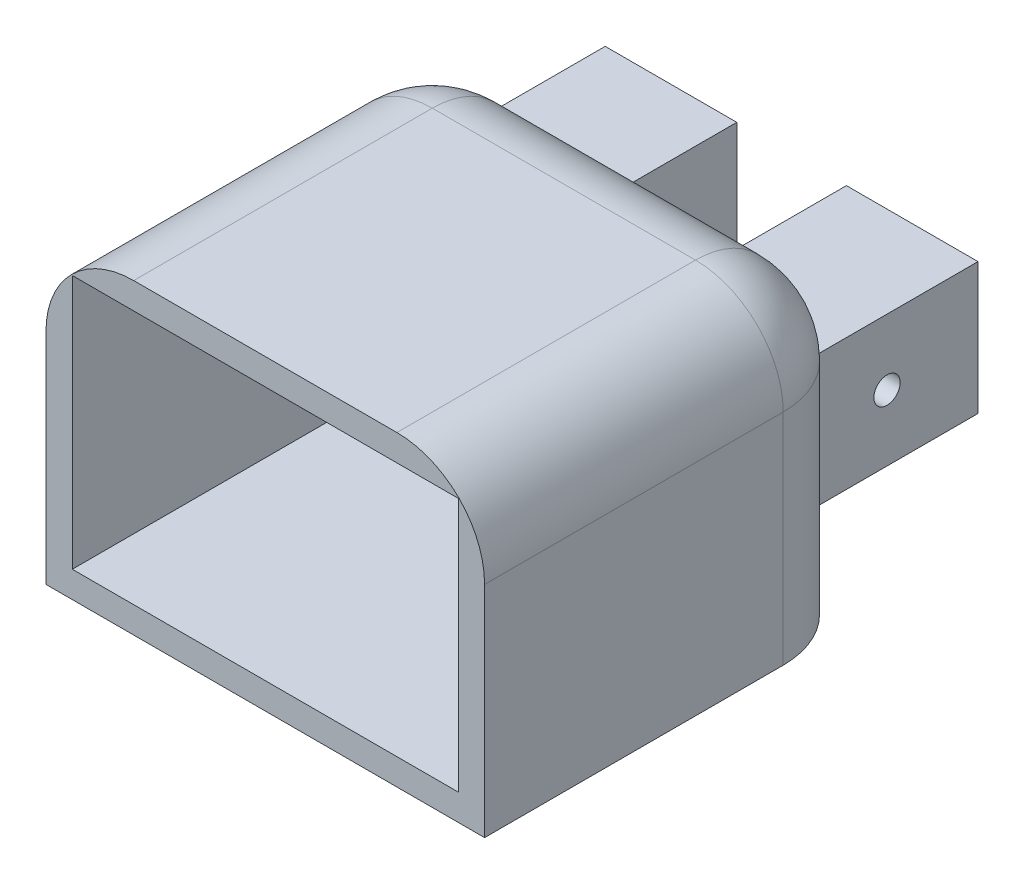
ISO-10303-21;
HEADER;
FILE_DESCRIPTION(('STEP AP214'),'2;1');
FILE_NAME('part.step','',(''),(''),'','','');
FILE_SCHEMA(('AUTOMOTIVE_DESIGN { 1 0 10303 214 1 1 1 1 }'));
ENDSEC;
DATA;
#1=APPLICATION_CONTEXT('core data for automotive mechanical design processes');
#2=APPLICATION_PROTOCOL_DEFINITION('international standard','automotive_design',2000,#1);
#3=PRODUCT_CONTEXT('',#1,'mechanical');
#4=PRODUCT('Part','Part','',(#3));
#5=PRODUCT_RELATED_PRODUCT_CATEGORY('part','',(#4));
#6=PRODUCT_DEFINITION_FORMATION('','',#4);
#7=PRODUCT_DEFINITION_CONTEXT('part definition',#1,'design');
#8=PRODUCT_DEFINITION('design','',#6,#7);
#9=PRODUCT_DEFINITION_SHAPE('','',#8);
#10=(LENGTH_UNIT() NAMED_UNIT(*) SI_UNIT(.MILLI.,.METRE.));
#11=(NAMED_UNIT(*) PLANE_ANGLE_UNIT() SI_UNIT($,.RADIAN.));
#12=(NAMED_UNIT(*) SI_UNIT($,.STERADIAN.) SOLID_ANGLE_UNIT());
#13=UNCERTAINTY_MEASURE_WITH_UNIT(LENGTH_MEASURE(1.E-05),#10,'distance_accuracy_value','');
#14=(GEOMETRIC_REPRESENTATION_CONTEXT(3) GLOBAL_UNCERTAINTY_ASSIGNED_CONTEXT((#13)) GLOBAL_UNIT_ASSIGNED_CONTEXT((#10,
#11,#12)) REPRESENTATION_CONTEXT('',''));
#15=CARTESIAN_POINT('',(0.,0.,0.));
#16=DIRECTION('',(0.,0.,1.));
#17=DIRECTION('',(1.,0.,0.));
#18=AXIS2_PLACEMENT_3D('',#15,#16,#17);
#19=CARTESIAN_POINT('',(-25.,35.,-40.2308510649238));
#20=DIRECTION('',(0.,0.,1.));
#21=DIRECTION('',(1.,0.,0.));
#22=AXIS2_PLACEMENT_3D('',#19,#20,#21);
#23=PLANE('',#22);
#24=DIRECTION('',(0.,-1.,0.));
#25=VECTOR('',#24,1.);
#26=CARTESIAN_POINT('',(-6.25000000000001,36.,-40.2308510649238));
#27=LINE('',#26,#25);
#28=CARTESIAN_POINT('',(-6.25000000000001,25.,-40.2308510649238));
#29=VERTEX_POINT('',#28);
#30=CARTESIAN_POINT('',(-6.25000000000001,10.,-40.2308510649238));
#31=VERTEX_POINT('',#30);
#32=EDGE_CURVE('E196',#29,#31,#27,.T.);
#33=ORIENTED_EDGE('',*,*,#32,.T.);
#34=DIRECTION('',(-1.,0.,0.));
#35=VECTOR('',#34,1.);
#36=CARTESIAN_POINT('',(28.92,10.,-40.2308510649238));
#37=LINE('',#36,#35);
#38=CARTESIAN_POINT('',(-21.25,10.,-40.2308510649238));
#39=VERTEX_POINT('',#38);
#40=EDGE_CURVE('E194',#31,#39,#37,.T.);
#41=ORIENTED_EDGE('',*,*,#40,.T.);
#42=DIRECTION('',(0.,-1.,0.));
#43=VECTOR('',#42,1.);
#44=CARTESIAN_POINT('',(-21.25,36.,-40.2308510649238));
#45=LINE('',#44,#43);
#46=CARTESIAN_POINT('',(-21.25,25.,-40.2308510649238));
#47=VERTEX_POINT('',#46);
#48=EDGE_CURVE('E188',#47,#39,#45,.T.);
#49=ORIENTED_EDGE('',*,*,#48,.F.);
#50=DIRECTION('',(-1.,0.,0.));
#51=VECTOR('',#50,1.);
#52=CARTESIAN_POINT('',(28.92,25.,-40.2308510649238));
#53=LINE('',#52,#51);
#54=EDGE_CURVE('E175',#29,#47,#53,.T.);
#55=ORIENTED_EDGE('',*,*,#54,.F.);
#56=EDGE_LOOP('',(#33,#41,#49,#55));
#57=FACE_BOUND('',#56,.T.);
#58=ADVANCED_FACE('F35',(#57),#23,.F.);
#59=CARTESIAN_POINT('',(-25.,35.,19.7691489350762));
#60=DIRECTION('',(0.,0.,-1.));
#61=DIRECTION('',(-1.,0.,0.));
#62=AXIS2_PLACEMENT_3D('',#59,#60,#61);
#63=PLANE('',#62);
#64=DIRECTION('',(1.,0.,0.));
#65=VECTOR('',#64,1.);
#66=CARTESIAN_POINT('',(-22.,3.,19.7691489350762));
#67=LINE('',#66,#65);
#68=CARTESIAN_POINT('',(-22.,3.,19.7691489350762));
#69=VERTEX_POINT('',#68);
#70=CARTESIAN_POINT('',(22.,3.,19.7691489350762));
#71=VERTEX_POINT('',#70);
#72=EDGE_CURVE('E198',#69,#71,#67,.T.);
#73=ORIENTED_EDGE('',*,*,#72,.F.);
#74=DIRECTION('',(0.,-1.,0.));
#75=VECTOR('',#74,1.);
#76=CARTESIAN_POINT('',(-22.,32.,19.7691489350762));
#77=LINE('',#76,#75);
#78=CARTESIAN_POINT('',(-22.,32.,19.7691489350762));
#79=VERTEX_POINT('',#78);
#80=EDGE_CURVE('E195',#79,#69,#77,.T.);
#81=ORIENTED_EDGE('',*,*,#80,.F.);
#82=DIRECTION('',(-1.,0.,0.));
#83=VECTOR('',#82,1.);
#84=CARTESIAN_POINT('',(-22.,32.,19.7691489350762));
#85=LINE('',#84,#83);
#86=CARTESIAN_POINT('',(22.,32.,19.7691489350762));
#87=VERTEX_POINT('',#86);
#88=EDGE_CURVE('E221',#87,#79,#85,.T.);
#89=ORIENTED_EDGE('',*,*,#88,.F.);
#90=DIRECTION('',(0.,1.,0.));
#91=VECTOR('',#90,1.);
#92=CARTESIAN_POINT('',(22.,32.,19.7691489350762));
#93=LINE('',#92,#91);
#94=EDGE_CURVE('E233',#71,#87,#93,.T.);
#95=ORIENTED_EDGE('',*,*,#94,.F.);
#96=EDGE_LOOP('',(#73,#81,#89,#95));
#97=FACE_BOUND('',#96,.T.);
#98=DIRECTION('',(0.,-1.,0.));
#99=VECTOR('',#98,1.);
#100=CARTESIAN_POINT('',(25.,35.,19.7691489350762));
#101=LINE('',#100,#99);
#102=CARTESIAN_POINT('',(25.,25.,19.7691489350762));
#103=VERTEX_POINT('',#102);
#104=CARTESIAN_POINT('',(25.,0.,19.7691489350762));
#105=VERTEX_POINT('',#104);
#106=EDGE_CURVE('E260',#103,#105,#101,.T.);
#107=ORIENTED_EDGE('',*,*,#106,.F.);
#108=CARTESIAN_POINT('',(15.,25.,19.7691489350762));
#109=DIRECTION('',(0.,0.,-1.));
#110=DIRECTION('',(-1.,0.,0.));
#111=AXIS2_PLACEMENT_3D('',#108,#109,#110);
#112=CIRCLE('',#111,10.);
#113=CARTESIAN_POINT('',(15.,35.,19.7691489350762));
#114=VERTEX_POINT('',#113);
#115=EDGE_CURVE('E310',#103,#114,#112,.F.);
#116=ORIENTED_EDGE('',*,*,#115,.T.);
#117=DIRECTION('',(1.,0.,0.));
#118=VECTOR('',#117,1.);
#119=CARTESIAN_POINT('',(-25.,35.,19.7691489350762));
#120=LINE('',#119,#118);
#121=CARTESIAN_POINT('',(-15.,35.,19.7691489350762));
#122=VERTEX_POINT('',#121);
#123=EDGE_CURVE('E247',#122,#114,#120,.T.);
#124=ORIENTED_EDGE('',*,*,#123,.F.);
#125=CARTESIAN_POINT('',(-15.,25.,19.7691489350762));
#126=DIRECTION('',(0.,0.,-1.));
#127=DIRECTION('',(-1.,0.,0.));
#128=AXIS2_PLACEMENT_3D('',#125,#126,#127);
#129=CIRCLE('',#128,10.);
#130=CARTESIAN_POINT('',(-25.,25.,19.7691489350762));
#131=VERTEX_POINT('',#130);
#132=EDGE_CURVE('E308',#122,#131,#129,.F.);
#133=ORIENTED_EDGE('',*,*,#132,.T.);
#134=DIRECTION('',(0.,-1.,0.));
#135=VECTOR('',#134,1.);
#136=CARTESIAN_POINT('',(-25.,35.,19.7691489350762));
#137=LINE('',#136,#135);
#138=CARTESIAN_POINT('',(-25.,0.,19.7691489350762));
#139=VERTEX_POINT('',#138);
#140=EDGE_CURVE('E250',#131,#139,#137,.T.);
#141=ORIENTED_EDGE('',*,*,#140,.T.);
#142=DIRECTION('',(1.,0.,0.));
#143=VECTOR('',#142,1.);
#144=CARTESIAN_POINT('',(-25.,0.,19.7691489350762));
#145=LINE('',#144,#143);
#146=EDGE_CURVE('E240',#139,#105,#145,.T.);
#147=ORIENTED_EDGE('',*,*,#146,.T.);
#148=EDGE_LOOP('',(#107,#116,#124,#133,#141,#147));
#149=FACE_BOUND('',#148,.T.);
#150=ADVANCED_FACE('F347',(#97,#149),#63,.F.);
#151=CARTESIAN_POINT('',(25.,35.,-40.2308510649238));
#152=DIRECTION('',(-1.,0.,0.));
#153=DIRECTION('',(0.,0.,1.));
#154=AXIS2_PLACEMENT_3D('',#151,#152,#153);
#155=PLANE('',#154);
#156=DIRECTION('',(0.,0.,-1.));
#157=VECTOR('',#156,1.);
#158=CARTESIAN_POINT('',(25.,0.,-40.2308510649238));
#159=LINE('',#158,#157);
#160=CARTESIAN_POINT('',(25.,0.,-14.2749331346808));
#161=VERTEX_POINT('',#160);
#162=EDGE_CURVE('E254',#105,#161,#159,.T.);
#163=ORIENTED_EDGE('',*,*,#162,.T.);
#164=DIRECTION('',(0.,1.,0.));
#165=VECTOR('',#164,1.);
#166=CARTESIAN_POINT('',(25.,35.,-14.2749331346808));
#167=LINE('',#166,#165);
#168=CARTESIAN_POINT('',(25.,25.,-14.2749331346808));
#169=VERTEX_POINT('',#168);
#170=EDGE_CURVE('E284',#161,#169,#167,.T.);
#171=ORIENTED_EDGE('',*,*,#170,.T.);
#172=DIRECTION('',(0.,0.,-1.));
#173=VECTOR('',#172,1.);
#174=CARTESIAN_POINT('',(25.,25.,-40.2308510649238));
#175=LINE('',#174,#173);
#176=EDGE_CURVE('E282',#169,#103,#175,.F.);
#177=ORIENTED_EDGE('',*,*,#176,.T.);
#178=ORIENTED_EDGE('',*,*,#106,.T.);
#179=EDGE_LOOP('',(#163,#171,#177,#178));
#180=FACE_BOUND('',#179,.T.);
#181=ADVANCED_FACE('F407',(#180),#155,.F.);
#182=DIRECTION('',(0.,-1.,0.));
#183=VECTOR('',#182,1.);
#184=CARTESIAN_POINT('',(21.25,36.,-40.2308510649238));
#185=LINE('',#184,#183);
#186=CARTESIAN_POINT('',(21.25,25.,-40.2308510649238));
#187=VERTEX_POINT('',#186);
#188=CARTESIAN_POINT('',(21.25,10.,-40.2308510649238));
#189=VERTEX_POINT('',#188);
#190=EDGE_CURVE('E214',#187,#189,#185,.T.);
#191=ORIENTED_EDGE('',*,*,#190,.T.);
#192=CARTESIAN_POINT('',(6.25,10.,-40.2308510649238));
#193=VERTEX_POINT('',#192);
#194=EDGE_CURVE('E369',#189,#193,#37,.T.);
#195=ORIENTED_EDGE('',*,*,#194,.T.);
#196=DIRECTION('',(0.,-1.,0.));
#197=VECTOR('',#196,1.);
#198=CARTESIAN_POINT('',(6.25,36.,-40.2308510649238));
#199=LINE('',#198,#197);
#200=CARTESIAN_POINT('',(6.25,25.,-40.2308510649238));
#201=VERTEX_POINT('',#200);
#202=EDGE_CURVE('E211',#201,#193,#199,.T.);
#203=ORIENTED_EDGE('',*,*,#202,.F.);
#204=EDGE_CURVE('E185',#187,#201,#53,.T.);
#205=ORIENTED_EDGE('',*,*,#204,.F.);
#206=EDGE_LOOP('',(#191,#195,#203,#205));
#207=FACE_BOUND('',#206,.T.);
#208=ADVANCED_FACE('F403',(#207),#23,.F.);
#209=CARTESIAN_POINT('',(-25.,35.,-40.2308510649238));
#210=DIRECTION('',(1.,0.,0.));
#211=DIRECTION('',(0.,0.,-1.));
#212=AXIS2_PLACEMENT_3D('',#209,#210,#211);
#213=PLANE('',#212);
#214=DIRECTION('',(0.,0.,1.));
#215=VECTOR('',#214,1.);
#216=CARTESIAN_POINT('',(-25.,25.,-40.2308510649238));
#217=LINE('',#216,#215);
#218=CARTESIAN_POINT('',(-25.,25.,-14.2749331346808));
#219=VERTEX_POINT('',#218);
#220=EDGE_CURVE('E299',#131,#219,#217,.F.);
#221=ORIENTED_EDGE('',*,*,#220,.T.);
#222=DIRECTION('',(0.,-1.,0.));
#223=VECTOR('',#222,1.);
#224=CARTESIAN_POINT('',(-25.,35.,-14.2749331346808));
#225=LINE('',#224,#223);
#226=CARTESIAN_POINT('',(-25.,0.,-14.2749331346808));
#227=VERTEX_POINT('',#226);
#228=EDGE_CURVE('E301',#219,#227,#225,.T.);
#229=ORIENTED_EDGE('',*,*,#228,.T.);
#230=DIRECTION('',(0.,0.,1.));
#231=VECTOR('',#230,1.);
#232=CARTESIAN_POINT('',(-25.,0.,-40.2308510649238));
#233=LINE('',#232,#231);
#234=EDGE_CURVE('E251',#227,#139,#233,.T.);
#235=ORIENTED_EDGE('',*,*,#234,.T.);
#236=ORIENTED_EDGE('',*,*,#140,.F.);
#237=EDGE_LOOP('',(#221,#229,#235,#236));
#238=FACE_BOUND('',#237,.T.);
#239=ADVANCED_FACE('F413',(#238),#213,.F.);
#240=CARTESIAN_POINT('',(0.,35.,0.));
#241=DIRECTION('',(0.,-1.,0.));
#242=DIRECTION('',(0.,0.,-1.));
#243=AXIS2_PLACEMENT_3D('',#240,#241,#242);
#244=PLANE('',#243);
#245=ORIENTED_EDGE('',*,*,#123,.T.);
#246=DIRECTION('',(0.,0.,-1.));
#247=VECTOR('',#246,1.);
#248=CARTESIAN_POINT('',(15.,35.,0.));
#249=LINE('',#248,#247);
#250=CARTESIAN_POINT('',(15.,35.,-14.2749331346808));
#251=VERTEX_POINT('',#250);
#252=EDGE_CURVE('E306',#114,#251,#249,.T.);
#253=ORIENTED_EDGE('',*,*,#252,.T.);
#254=DIRECTION('',(-1.,0.,0.));
#255=VECTOR('',#254,1.);
#256=CARTESIAN_POINT('',(0.,35.,-14.2749331346808));
#257=LINE('',#256,#255);
#258=CARTESIAN_POINT('',(-15.,35.,-14.2749331346808));
#259=VERTEX_POINT('',#258);
#260=EDGE_CURVE('E276',#251,#259,#257,.T.);
#261=ORIENTED_EDGE('',*,*,#260,.T.);
#262=DIRECTION('',(0.,0.,1.));
#263=VECTOR('',#262,1.);
#264=CARTESIAN_POINT('',(-15.,35.,0.));
#265=LINE('',#264,#263);
#266=EDGE_CURVE('E304',#259,#122,#265,.T.);
#267=ORIENTED_EDGE('',*,*,#266,.T.);
#268=EDGE_LOOP('',(#245,#253,#261,#267));
#269=FACE_BOUND('',#268,.T.);
#270=ADVANCED_FACE('F342',(#269),#244,.F.);
#271=CARTESIAN_POINT('',(0.,0.,0.));
#272=DIRECTION('',(0.,-1.,0.));
#273=DIRECTION('',(0.,0.,-1.));
#274=AXIS2_PLACEMENT_3D('',#271,#272,#273);
#275=PLANE('',#274);
#276=DIRECTION('',(-1.,0.,0.));
#277=VECTOR('',#276,1.);
#278=CARTESIAN_POINT('',(0.,0.,-24.2749331346808));
#279=LINE('',#278,#277);
#280=CARTESIAN_POINT('',(15.,0.,-24.2749331346808));
#281=VERTEX_POINT('',#280);
#282=CARTESIAN_POINT('',(-15.,0.,-24.2749331346808));
#283=VERTEX_POINT('',#282);
#284=EDGE_CURVE('E262',#281,#283,#279,.T.);
#285=ORIENTED_EDGE('',*,*,#284,.F.);
#286=CARTESIAN_POINT('',(15.,0.,-14.2749331346808));
#287=DIRECTION('',(0.,-1.,0.));
#288=DIRECTION('',(0.,0.,-1.));
#289=AXIS2_PLACEMENT_3D('',#286,#287,#288);
#290=CIRCLE('',#289,10.);
#291=EDGE_CURVE('E293',#281,#161,#290,.T.);
#292=ORIENTED_EDGE('',*,*,#291,.T.);
#293=ORIENTED_EDGE('',*,*,#162,.F.);
#294=ORIENTED_EDGE('',*,*,#146,.F.);
#295=ORIENTED_EDGE('',*,*,#234,.F.);
#296=CARTESIAN_POINT('',(-15.,0.,-14.2749331346808));
#297=DIRECTION('',(0.,-1.,0.));
#298=DIRECTION('',(0.,0.,-1.));
#299=AXIS2_PLACEMENT_3D('',#296,#297,#298);
#300=CIRCLE('',#299,10.);
#301=EDGE_CURVE('E291',#227,#283,#300,.T.);
#302=ORIENTED_EDGE('',*,*,#301,.T.);
#303=EDGE_LOOP('',(#285,#292,#293,#294,#295,#302));
#304=FACE_BOUND('',#303,.T.);
#305=ADVANCED_FACE('F569',(#304),#275,.T.);
#306=CARTESIAN_POINT('',(-22.,32.,-10.2308510649238));
#307=DIRECTION('',(-1.,0.,0.));
#308=DIRECTION('',(0.,0.,1.));
#309=AXIS2_PLACEMENT_3D('',#306,#307,#308);
#310=PLANE('',#309);
#311=ORIENTED_EDGE('',*,*,#80,.T.);
#312=DIRECTION('',(0.,0.,1.));
#313=VECTOR('',#312,1.);
#314=CARTESIAN_POINT('',(-22.,3.,-10.2308510649238));
#315=LINE('',#314,#313);
#316=CARTESIAN_POINT('',(-22.,3.,-10.2308510649238));
#317=VERTEX_POINT('',#316);
#318=EDGE_CURVE('E229',#317,#69,#315,.T.);
#319=ORIENTED_EDGE('',*,*,#318,.F.);
#320=DIRECTION('',(0.,-1.,0.));
#321=VECTOR('',#320,1.);
#322=CARTESIAN_POINT('',(-22.,32.,-10.2308510649238));
#323=LINE('',#322,#321);
#324=CARTESIAN_POINT('',(-22.,32.,-10.2308510649238));
#325=VERTEX_POINT('',#324);
#326=EDGE_CURVE('E217',#325,#317,#323,.T.);
#327=ORIENTED_EDGE('',*,*,#326,.F.);
#328=DIRECTION('',(0.,0.,1.));
#329=VECTOR('',#328,1.);
#330=CARTESIAN_POINT('',(-22.,32.,-10.2308510649238));
#331=LINE('',#330,#329);
#332=EDGE_CURVE('E238',#325,#79,#331,.T.);
#333=ORIENTED_EDGE('',*,*,#332,.T.);
#334=EDGE_LOOP('',(#311,#319,#327,#333));
#335=FACE_BOUND('',#334,.T.);
#336=ADVANCED_FACE('F574',(#335),#310,.F.);
#337=CARTESIAN_POINT('',(-22.,32.,-10.2308510649238));
#338=DIRECTION('',(0.,1.,0.));
#339=DIRECTION('',(0.,0.,1.));
#340=AXIS2_PLACEMENT_3D('',#337,#338,#339);
#341=PLANE('',#340);
#342=ORIENTED_EDGE('',*,*,#88,.T.);
#343=ORIENTED_EDGE('',*,*,#332,.F.);
#344=DIRECTION('',(-1.,0.,0.));
#345=VECTOR('',#344,1.);
#346=CARTESIAN_POINT('',(-22.,32.,-10.2308510649238));
#347=LINE('',#346,#345);
#348=CARTESIAN_POINT('',(22.,32.,-10.2308510649238));
#349=VERTEX_POINT('',#348);
#350=EDGE_CURVE('E227',#349,#325,#347,.T.);
#351=ORIENTED_EDGE('',*,*,#350,.F.);
#352=DIRECTION('',(0.,0.,1.));
#353=VECTOR('',#352,1.);
#354=CARTESIAN_POINT('',(22.,32.,-10.2308510649238));
#355=LINE('',#354,#353);
#356=EDGE_CURVE('E241',#349,#87,#355,.T.);
#357=ORIENTED_EDGE('',*,*,#356,.T.);
#358=EDGE_LOOP('',(#342,#343,#351,#357));
#359=FACE_BOUND('',#358,.T.);
#360=ADVANCED_FACE('F663',(#359),#341,.F.);
#361=CARTESIAN_POINT('',(22.,32.,-10.2308510649238));
#362=DIRECTION('',(1.,0.,0.));
#363=DIRECTION('',(0.,0.,-1.));
#364=AXIS2_PLACEMENT_3D('',#361,#362,#363);
#365=PLANE('',#364);
#366=ORIENTED_EDGE('',*,*,#94,.T.);
#367=ORIENTED_EDGE('',*,*,#356,.F.);
#368=DIRECTION('',(0.,1.,0.));
#369=VECTOR('',#368,1.);
#370=CARTESIAN_POINT('',(22.,32.,-10.2308510649238));
#371=LINE('',#370,#369);
#372=CARTESIAN_POINT('',(22.,3.,-10.2308510649238));
#373=VERTEX_POINT('',#372);
#374=EDGE_CURVE('E224',#373,#349,#371,.T.);
#375=ORIENTED_EDGE('',*,*,#374,.F.);
#376=DIRECTION('',(0.,0.,1.));
#377=VECTOR('',#376,1.);
#378=CARTESIAN_POINT('',(22.,3.,-10.2308510649238));
#379=LINE('',#378,#377);
#380=EDGE_CURVE('E243',#373,#71,#379,.T.);
#381=ORIENTED_EDGE('',*,*,#380,.T.);
#382=EDGE_LOOP('',(#366,#367,#375,#381));
#383=FACE_BOUND('',#382,.T.);
#384=ADVANCED_FACE('F653',(#383),#365,.F.);
#385=CARTESIAN_POINT('',(-22.,3.,-10.2308510649238));
#386=DIRECTION('',(0.,-1.,0.));
#387=DIRECTION('',(0.,0.,-1.));
#388=AXIS2_PLACEMENT_3D('',#385,#386,#387);
#389=PLANE('',#388);
#390=ORIENTED_EDGE('',*,*,#72,.T.);
#391=ORIENTED_EDGE('',*,*,#380,.F.);
#392=DIRECTION('',(1.,0.,0.));
#393=VECTOR('',#392,1.);
#394=CARTESIAN_POINT('',(-22.,3.,-10.2308510649238));
#395=LINE('',#394,#393);
#396=EDGE_CURVE('E220',#317,#373,#395,.T.);
#397=ORIENTED_EDGE('',*,*,#396,.F.);
#398=ORIENTED_EDGE('',*,*,#318,.T.);
#399=EDGE_LOOP('',(#390,#391,#397,#398));
#400=FACE_BOUND('',#399,.T.);
#401=ADVANCED_FACE('F643',(#400),#389,.F.);
#402=CARTESIAN_POINT('',(0.,0.,-10.2308510649238));
#403=DIRECTION('',(0.,0.,1.));
#404=DIRECTION('',(1.,0.,0.));
#405=AXIS2_PLACEMENT_3D('',#402,#403,#404);
#406=PLANE('',#405);
#407=ORIENTED_EDGE('',*,*,#326,.T.);
#408=ORIENTED_EDGE('',*,*,#396,.T.);
#409=ORIENTED_EDGE('',*,*,#374,.T.);
#410=ORIENTED_EDGE('',*,*,#350,.T.);
#411=EDGE_LOOP('',(#407,#408,#409,#410));
#412=FACE_BOUND('',#411,.T.);
#413=ADVANCED_FACE('F562',(#412),#406,.T.);
#414=CARTESIAN_POINT('',(-21.25,36.,-40.2308510649238));
#415=DIRECTION('',(1.,0.,0.));
#416=DIRECTION('',(0.,0.,-1.));
#417=AXIS2_PLACEMENT_3D('',#414,#415,#416);
#418=PLANE('',#417);
#419=CARTESIAN_POINT('',(-21.25,17.5,-29.8590248546378));
#420=DIRECTION('',(1.,0.,0.));
#421=DIRECTION('',(0.,0.,-1.));
#422=AXIS2_PLACEMENT_3D('',#419,#420,#421);
#423=CIRCLE('',#422,1.50000000000001);
#424=CARTESIAN_POINT('',(-21.25,17.5,-31.3590248546378));
#425=VERTEX_POINT('',#424);
#426=EDGE_CURVE('E203',#425,#425,#423,.T.);
#427=ORIENTED_EDGE('',*,*,#426,.T.);
#428=EDGE_LOOP('',(#427));
#429=FACE_BOUND('',#428,.T.);
#430=ORIENTED_EDGE('',*,*,#48,.T.);
#431=DIRECTION('',(0.,0.,-1.));
#432=VECTOR('',#431,1.);
#433=CARTESIAN_POINT('',(-21.25,10.,-40.2308510649238));
#434=LINE('',#433,#432);
#435=CARTESIAN_POINT('',(-21.25,10.,-22.0811806326788));
#436=VERTEX_POINT('',#435);
#437=EDGE_CURVE('E54',#436,#39,#434,.T.);
#438=ORIENTED_EDGE('',*,*,#437,.F.);
#439=DIRECTION('',(0.,-1.,0.));
#440=VECTOR('',#439,1.);
#441=CARTESIAN_POINT('',(-21.25,10.,-22.0811806326788));
#442=LINE('',#441,#440);
#443=CARTESIAN_POINT('',(-21.25,25.,-22.0811806326788));
#444=VERTEX_POINT('',#443);
#445=EDGE_CURVE('E45',#436,#444,#442,.F.);
#446=ORIENTED_EDGE('',*,*,#445,.T.);
#447=DIRECTION('',(0.,0.,1.));
#448=VECTOR('',#447,1.);
#449=CARTESIAN_POINT('',(-21.25,25.,-24.2749331346808));
#450=LINE('',#449,#448);
#451=EDGE_CURVE('E178',#47,#444,#450,.T.);
#452=ORIENTED_EDGE('',*,*,#451,.F.);
#453=EDGE_LOOP('',(#430,#438,#446,#452));
#454=FACE_BOUND('',#453,.T.);
#455=ADVANCED_FACE('F187',(#429,#454),#418,.F.);
#456=CARTESIAN_POINT('',(21.25,36.,-24.2749331346808));
#457=DIRECTION('',(-1.,0.,0.));
#458=DIRECTION('',(0.,0.,1.));
#459=AXIS2_PLACEMENT_3D('',#456,#457,#458);
#460=PLANE('',#459);
#461=CARTESIAN_POINT('',(21.25,17.5,-29.8590248546377));
#462=DIRECTION('',(1.,0.,0.));
#463=DIRECTION('',(0.,0.,-1.));
#464=AXIS2_PLACEMENT_3D('',#461,#462,#463);
#465=CIRCLE('',#464,1.50000000000001);
#466=CARTESIAN_POINT('',(21.25,17.5,-31.3590248546377));
#467=VERTEX_POINT('',#466);
#468=EDGE_CURVE('E270',#467,#467,#465,.T.);
#469=ORIENTED_EDGE('',*,*,#468,.F.);
#470=EDGE_LOOP('',(#469));
#471=FACE_BOUND('',#470,.T.);
#472=DIRECTION('',(0.,0.,1.));
#473=VECTOR('',#472,1.);
#474=CARTESIAN_POINT('',(21.25,25.,-24.2749331346808));
#475=LINE('',#474,#473);
#476=CARTESIAN_POINT('',(21.25,25.,-22.0811806326788));
#477=VERTEX_POINT('',#476);
#478=EDGE_CURVE('E368',#187,#477,#475,.T.);
#479=ORIENTED_EDGE('',*,*,#478,.T.);
#480=DIRECTION('',(0.,1.,0.));
#481=VECTOR('',#480,1.);
#482=CARTESIAN_POINT('',(21.25,25.,-22.0811806326788));
#483=LINE('',#482,#481);
#484=CARTESIAN_POINT('',(21.25,10.,-22.0811806326788));
#485=VERTEX_POINT('',#484);
#486=EDGE_CURVE('E312',#477,#485,#483,.F.);
#487=ORIENTED_EDGE('',*,*,#486,.T.);
#488=DIRECTION('',(0.,0.,-1.));
#489=VECTOR('',#488,1.);
#490=CARTESIAN_POINT('',(21.25,10.,-24.2749331346808));
#491=LINE('',#490,#489);
#492=EDGE_CURVE('E374',#485,#189,#491,.T.);
#493=ORIENTED_EDGE('',*,*,#492,.T.);
#494=ORIENTED_EDGE('',*,*,#190,.F.);
#495=EDGE_LOOP('',(#479,#487,#493,#494));
#496=FACE_BOUND('',#495,.T.);
#497=ADVANCED_FACE('F426',(#471,#496),#460,.F.);
#498=CARTESIAN_POINT('',(-6.25000000000001,36.,-24.2749331346808));
#499=DIRECTION('',(-1.,0.,0.));
#500=DIRECTION('',(0.,0.,1.));
#501=AXIS2_PLACEMENT_3D('',#498,#499,#500);
#502=PLANE('',#501);
#503=CARTESIAN_POINT('',(-6.25000000000001,17.5,-29.8590248546378));
#504=DIRECTION('',(-1.,0.,0.));
#505=DIRECTION('',(0.,0.,1.));
#506=AXIS2_PLACEMENT_3D('',#503,#504,#505);
#507=CIRCLE('',#506,1.50000000000001);
#508=CARTESIAN_POINT('',(-6.25000000000001,17.5,-28.3590248546378));
#509=VERTEX_POINT('',#508);
#510=EDGE_CURVE('E269',#509,#509,#507,.T.);
#511=ORIENTED_EDGE('',*,*,#510,.T.);
#512=EDGE_LOOP('',(#511));
#513=FACE_BOUND('',#512,.T.);
#514=DIRECTION('',(0.,-1.,0.));
#515=VECTOR('',#514,1.);
#516=CARTESIAN_POINT('',(-6.25000000000001,36.,-24.2749331346808));
#517=LINE('',#516,#515);
#518=CARTESIAN_POINT('',(-6.25000000000001,25.,-24.2749331346808));
#519=VERTEX_POINT('',#518);
#520=CARTESIAN_POINT('',(-6.25000000000001,10.,-24.2749331346808));
#521=VERTEX_POINT('',#520);
#522=EDGE_CURVE('E200',#519,#521,#517,.T.);
#523=ORIENTED_EDGE('',*,*,#522,.T.);
#524=DIRECTION('',(0.,0.,-1.));
#525=VECTOR('',#524,1.);
#526=CARTESIAN_POINT('',(-6.25000000000001,10.,-24.2749331346808));
#527=LINE('',#526,#525);
#528=EDGE_CURVE('E371',#521,#31,#527,.T.);
#529=ORIENTED_EDGE('',*,*,#528,.T.);
#530=ORIENTED_EDGE('',*,*,#32,.F.);
#531=DIRECTION('',(0.,0.,1.));
#532=VECTOR('',#531,1.);
#533=CARTESIAN_POINT('',(-6.25000000000001,25.,-24.2749331346808));
#534=LINE('',#533,#532);
#535=EDGE_CURVE('E180',#29,#519,#534,.T.);
#536=ORIENTED_EDGE('',*,*,#535,.T.);
#537=EDGE_LOOP('',(#523,#529,#530,#536));
#538=FACE_BOUND('',#537,.T.);
#539=ADVANCED_FACE('F537',(#513,#538),#502,.F.);
#540=CARTESIAN_POINT('',(6.24999999999999,36.,-24.2749331346808));
#541=DIRECTION('',(0.,0.,1.));
#542=DIRECTION('',(1.,0.,0.));
#543=AXIS2_PLACEMENT_3D('',#540,#541,#542);
#544=PLANE('',#543);
#545=DIRECTION('',(-1.,0.,0.));
#546=VECTOR('',#545,1.);
#547=CARTESIAN_POINT('',(28.92,10.,-24.2749331346808));
#548=LINE('',#547,#546);
#549=CARTESIAN_POINT('',(15.,10.,-24.2749331346808));
#550=VERTEX_POINT('',#549);
#551=CARTESIAN_POINT('',(6.24999999999999,10.,-24.2749331346808));
#552=VERTEX_POINT('',#551);
#553=EDGE_CURVE('E431',#550,#552,#548,.T.);
#554=ORIENTED_EDGE('',*,*,#553,.F.);
#555=DIRECTION('',(0.,1.,0.));
#556=VECTOR('',#555,1.);
#557=CARTESIAN_POINT('',(15.,36.,-24.2749331346808));
#558=LINE('',#557,#556);
#559=EDGE_CURVE('E289',#550,#281,#558,.F.);
#560=ORIENTED_EDGE('',*,*,#559,.T.);
#561=ORIENTED_EDGE('',*,*,#284,.T.);
#562=DIRECTION('',(0.,-1.,0.));
#563=VECTOR('',#562,1.);
#564=CARTESIAN_POINT('',(-15.,36.,-24.2749331346808));
#565=LINE('',#564,#563);
#566=CARTESIAN_POINT('',(-15.,10.,-24.2749331346808));
#567=VERTEX_POINT('',#566);
#568=EDGE_CURVE('E287',#283,#567,#565,.F.);
#569=ORIENTED_EDGE('',*,*,#568,.T.);
#570=EDGE_CURVE('E363',#521,#567,#548,.T.);
#571=ORIENTED_EDGE('',*,*,#570,.F.);
#572=ORIENTED_EDGE('',*,*,#522,.F.);
#573=DIRECTION('',(-1.,0.,0.));
#574=VECTOR('',#573,1.);
#575=CARTESIAN_POINT('',(6.24999999999999,25.,-24.2749331346808));
#576=LINE('',#575,#574);
#577=CARTESIAN_POINT('',(6.25,25.,-24.2749331346808));
#578=VERTEX_POINT('',#577);
#579=EDGE_CURVE('E279',#519,#578,#576,.F.);
#580=ORIENTED_EDGE('',*,*,#579,.T.);
#581=DIRECTION('',(0.,-1.,0.));
#582=VECTOR('',#581,1.);
#583=CARTESIAN_POINT('',(6.24999999999999,36.,-24.2749331346808));
#584=LINE('',#583,#582);
#585=EDGE_CURVE('E208',#578,#552,#584,.T.);
#586=ORIENTED_EDGE('',*,*,#585,.T.);
#587=EDGE_LOOP('',(#554,#560,#561,#569,#571,#572,#580,#586));
#588=FACE_BOUND('',#587,.T.);
#589=ADVANCED_FACE('F532',(#588),#544,.F.);
#590=CARTESIAN_POINT('',(6.25,36.,-40.2308510649238));
#591=DIRECTION('',(1.,0.,0.));
#592=DIRECTION('',(0.,0.,-1.));
#593=AXIS2_PLACEMENT_3D('',#590,#591,#592);
#594=PLANE('',#593);
#595=CARTESIAN_POINT('',(6.25,17.5,-29.8590248546377));
#596=DIRECTION('',(1.,0.,0.));
#597=DIRECTION('',(0.,0.,-1.));
#598=AXIS2_PLACEMENT_3D('',#595,#596,#597);
#599=CIRCLE('',#598,1.50000000000001);
#600=CARTESIAN_POINT('',(6.25,17.5,-31.3590248546378));
#601=VERTEX_POINT('',#600);
#602=EDGE_CURVE('E266',#601,#601,#599,.T.);
#603=ORIENTED_EDGE('',*,*,#602,.T.);
#604=EDGE_LOOP('',(#603));
#605=FACE_BOUND('',#604,.T.);
#606=ORIENTED_EDGE('',*,*,#202,.T.);
#607=DIRECTION('',(0.,0.,1.));
#608=VECTOR('',#607,1.);
#609=CARTESIAN_POINT('',(6.25,10.,-40.2308510649238));
#610=LINE('',#609,#608);
#611=EDGE_CURVE('E273',#193,#552,#610,.T.);
#612=ORIENTED_EDGE('',*,*,#611,.T.);
#613=ORIENTED_EDGE('',*,*,#585,.F.);
#614=DIRECTION('',(0.,0.,-1.));
#615=VECTOR('',#614,1.);
#616=CARTESIAN_POINT('',(6.25,25.,-40.2308510649238));
#617=LINE('',#616,#615);
#618=EDGE_CURVE('E265',#578,#201,#617,.T.);
#619=ORIENTED_EDGE('',*,*,#618,.T.);
#620=EDGE_LOOP('',(#606,#612,#613,#619));
#621=FACE_BOUND('',#620,.T.);
#622=ADVANCED_FACE('F398',(#605,#621),#594,.F.);
#623=CARTESIAN_POINT('',(-26.75,17.5,-29.8590248546378));
#624=DIRECTION('',(1.,0.,0.));
#625=DIRECTION('',(0.,0.,-1.));
#626=AXIS2_PLACEMENT_3D('',#623,#624,#625);
#627=CYLINDRICAL_SURFACE('',#626,1.50000000000001);
#628=ORIENTED_EDGE('',*,*,#468,.T.);
#629=EDGE_LOOP('',(#628));
#630=FACE_BOUND('',#629,.T.);
#631=ORIENTED_EDGE('',*,*,#602,.F.);
#632=EDGE_LOOP('',(#631));
#633=FACE_BOUND('',#632,.T.);
#634=ADVANCED_FACE('F388',(#630,#633),#627,.F.);
#635=ORIENTED_EDGE('',*,*,#510,.F.);
#636=EDGE_LOOP('',(#635));
#637=FACE_BOUND('',#636,.T.);
#638=ORIENTED_EDGE('',*,*,#426,.F.);
#639=EDGE_LOOP('',(#638));
#640=FACE_BOUND('',#639,.T.);
#641=ADVANCED_FACE('F385',(#637,#640),#627,.F.);
#642=CARTESIAN_POINT('',(28.92,25.,-24.2749331346808));
#643=DIRECTION('',(0.,-1.,0.));
#644=DIRECTION('',(0.,0.,-1.));
#645=AXIS2_PLACEMENT_3D('',#642,#643,#644);
#646=PLANE('',#645);
#647=ORIENTED_EDGE('',*,*,#204,.T.);
#648=ORIENTED_EDGE('',*,*,#618,.F.);
#649=DIRECTION('',(-1.,0.,0.));
#650=VECTOR('',#649,1.);
#651=CARTESIAN_POINT('',(28.92,25.,-24.2749331346808));
#652=LINE('',#651,#650);
#653=CARTESIAN_POINT('',(15.,25.,-24.2749331346808));
#654=VERTEX_POINT('',#653);
#655=EDGE_CURVE('E361',#654,#578,#652,.T.);
#656=ORIENTED_EDGE('',*,*,#655,.F.);
#657=CARTESIAN_POINT('',(15.,25.,-14.2749331346808));
#658=DIRECTION('',(0.,-1.,0.));
#659=DIRECTION('',(0.,0.,-1.));
#660=AXIS2_PLACEMENT_3D('',#657,#658,#659);
#661=CIRCLE('',#660,10.);
#662=EDGE_CURVE('E317',#654,#477,#661,.T.);
#663=ORIENTED_EDGE('',*,*,#662,.T.);
#664=ORIENTED_EDGE('',*,*,#478,.F.);
#665=EDGE_LOOP('',(#647,#648,#656,#663,#664));
#666=FACE_BOUND('',#665,.T.);
#667=ADVANCED_FACE('F387',(#666),#646,.F.);
#668=CARTESIAN_POINT('',(28.92,10.,-40.2308510649238));
#669=DIRECTION('',(0.,1.,0.));
#670=DIRECTION('',(0.,0.,1.));
#671=AXIS2_PLACEMENT_3D('',#668,#669,#670);
#672=PLANE('',#671);
#673=ORIENTED_EDGE('',*,*,#492,.F.);
#674=CARTESIAN_POINT('',(15.,10.,-14.2749331346808));
#675=DIRECTION('',(0.,1.,0.));
#676=DIRECTION('',(0.,0.,1.));
#677=AXIS2_PLACEMENT_3D('',#674,#675,#676);
#678=CIRCLE('',#677,10.);
#679=EDGE_CURVE('E315',#485,#550,#678,.T.);
#680=ORIENTED_EDGE('',*,*,#679,.T.);
#681=ORIENTED_EDGE('',*,*,#553,.T.);
#682=ORIENTED_EDGE('',*,*,#611,.F.);
#683=ORIENTED_EDGE('',*,*,#194,.F.);
#684=EDGE_LOOP('',(#673,#680,#681,#682,#683));
#685=FACE_BOUND('',#684,.T.);
#686=ADVANCED_FACE('F395',(#685),#672,.F.);
#687=ORIENTED_EDGE('',*,*,#54,.T.);
#688=ORIENTED_EDGE('',*,*,#451,.T.);
#689=CARTESIAN_POINT('',(-15.,25.,-14.2749331346808));
#690=DIRECTION('',(0.,-1.,0.));
#691=DIRECTION('',(0.,0.,-1.));
#692=AXIS2_PLACEMENT_3D('',#689,#690,#691);
#693=CIRCLE('',#692,10.);
#694=CARTESIAN_POINT('',(-15.,25.,-24.2749331346808));
#695=VERTEX_POINT('',#694);
#696=EDGE_CURVE('E11',#444,#695,#693,.T.);
#697=ORIENTED_EDGE('',*,*,#696,.T.);
#698=EDGE_CURVE('E360',#519,#695,#652,.T.);
#699=ORIENTED_EDGE('',*,*,#698,.F.);
#700=ORIENTED_EDGE('',*,*,#535,.F.);
#701=EDGE_LOOP('',(#687,#688,#697,#699,#700));
#702=FACE_BOUND('',#701,.T.);
#703=ADVANCED_FACE('F177',(#702),#646,.F.);
#704=ORIENTED_EDGE('',*,*,#570,.T.);
#705=CARTESIAN_POINT('',(-15.,10.,-14.2749331346808));
#706=DIRECTION('',(0.,1.,0.));
#707=DIRECTION('',(0.,0.,1.));
#708=AXIS2_PLACEMENT_3D('',#705,#706,#707);
#709=CIRCLE('',#708,10.);
#710=EDGE_CURVE('E320',#567,#436,#709,.T.);
#711=ORIENTED_EDGE('',*,*,#710,.T.);
#712=ORIENTED_EDGE('',*,*,#437,.T.);
#713=ORIENTED_EDGE('',*,*,#40,.F.);
#714=ORIENTED_EDGE('',*,*,#528,.F.);
#715=EDGE_LOOP('',(#704,#711,#712,#713,#714));
#716=FACE_BOUND('',#715,.T.);
#717=ADVANCED_FACE('F435',(#716),#672,.F.);
#718=CARTESIAN_POINT('',(0.,25.,-14.2749331346808));
#719=DIRECTION('',(-1.,0.,0.));
#720=DIRECTION('',(0.,0.,1.));
#721=AXIS2_PLACEMENT_3D('',#718,#719,#720);
#722=CYLINDRICAL_SURFACE('',#721,10.);
#723=ORIENTED_EDGE('',*,*,#260,.F.);
#724=CARTESIAN_POINT('',(15.,25.,-14.2749331346808));
#725=DIRECTION('',(-1.,0.,0.));
#726=DIRECTION('',(0.,0.,1.));
#727=AXIS2_PLACEMENT_3D('',#724,#725,#726);
#728=CIRCLE('',#727,10.);
#729=EDGE_CURVE('E297',#251,#654,#728,.T.);
#730=ORIENTED_EDGE('',*,*,#729,.T.);
#731=ORIENTED_EDGE('',*,*,#655,.T.);
#732=ORIENTED_EDGE('',*,*,#579,.F.);
#733=ORIENTED_EDGE('',*,*,#698,.T.);
#734=CARTESIAN_POINT('',(-15.,25.,-14.2749331346808));
#735=DIRECTION('',(-1.,0.,0.));
#736=DIRECTION('',(0.,0.,1.));
#737=AXIS2_PLACEMENT_3D('',#734,#735,#736);
#738=CIRCLE('',#737,10.);
#739=EDGE_CURVE('E295',#695,#259,#738,.F.);
#740=ORIENTED_EDGE('',*,*,#739,.T.);
#741=EDGE_LOOP('',(#723,#730,#731,#732,#733,#740));
#742=FACE_BOUND('',#741,.T.);
#743=ADVANCED_FACE('F356',(#742),#722,.T.);
#744=CARTESIAN_POINT('',(15.,25.,0.));
#745=DIRECTION('',(0.,0.,-1.));
#746=DIRECTION('',(-1.,0.,0.));
#747=AXIS2_PLACEMENT_3D('',#744,#745,#746);
#748=CYLINDRICAL_SURFACE('',#747,10.);
#749=CARTESIAN_POINT('',(15.,25.,-14.2749331346808));
#750=DIRECTION('',(0.,0.,-1.));
#751=DIRECTION('',(-1.,0.,0.));
#752=AXIS2_PLACEMENT_3D('',#749,#750,#751);
#753=CIRCLE('',#752,10.);
#754=EDGE_CURVE('E191',#251,#169,#753,.T.);
#755=ORIENTED_EDGE('',*,*,#754,.F.);
#756=ORIENTED_EDGE('',*,*,#252,.F.);
#757=ORIENTED_EDGE('',*,*,#115,.F.);
#758=ORIENTED_EDGE('',*,*,#176,.F.);
#759=EDGE_LOOP('',(#755,#756,#757,#758));
#760=FACE_BOUND('',#759,.T.);
#761=ADVANCED_FACE('F353',(#760),#748,.T.);
#762=CARTESIAN_POINT('',(15.,25.,-14.2749331346808));
#763=DIRECTION('',(-1.,0.,0.));
#764=DIRECTION('',(0.,0.,1.));
#765=AXIS2_PLACEMENT_3D('',#762,#763,#764);
#766=SPHERICAL_SURFACE('',#765,10.);
#767=ORIENTED_EDGE('',*,*,#729,.F.);
#768=ORIENTED_EDGE('',*,*,#754,.T.);
#769=CARTESIAN_POINT('',(15.,25.,-14.2749331346808));
#770=DIRECTION('',(0.,1.,0.));
#771=DIRECTION('',(0.,0.,1.));
#772=AXIS2_PLACEMENT_3D('',#769,#770,#771);
#773=CIRCLE('',#772,10.);
#774=EDGE_CURVE('E323',#477,#169,#773,.F.);
#775=ORIENTED_EDGE('',*,*,#774,.F.);
#776=ORIENTED_EDGE('',*,*,#662,.F.);
#777=EDGE_LOOP('',(#767,#768,#775,#776));
#778=FACE_BOUND('',#777,.T.);
#779=ADVANCED_FACE('F448',(#778),#766,.T.);
#780=CARTESIAN_POINT('',(15.,35.,-14.2749331346808));
#781=DIRECTION('',(0.,1.,0.));
#782=DIRECTION('',(0.,0.,1.));
#783=AXIS2_PLACEMENT_3D('',#780,#781,#782);
#784=CYLINDRICAL_SURFACE('',#783,10.);
#785=ORIENTED_EDGE('',*,*,#291,.F.);
#786=ORIENTED_EDGE('',*,*,#559,.F.);
#787=ORIENTED_EDGE('',*,*,#679,.F.);
#788=ORIENTED_EDGE('',*,*,#486,.F.);
#789=ORIENTED_EDGE('',*,*,#774,.T.);
#790=ORIENTED_EDGE('',*,*,#170,.F.);
#791=EDGE_LOOP('',(#785,#786,#787,#788,#789,#790));
#792=FACE_BOUND('',#791,.T.);
#793=ADVANCED_FACE('F451',(#792),#784,.T.);
#794=CARTESIAN_POINT('',(-15.,25.,0.));
#795=DIRECTION('',(0.,0.,1.));
#796=DIRECTION('',(1.,0.,0.));
#797=AXIS2_PLACEMENT_3D('',#794,#795,#796);
#798=CYLINDRICAL_SURFACE('',#797,10.);
#799=ORIENTED_EDGE('',*,*,#132,.F.);
#800=ORIENTED_EDGE('',*,*,#266,.F.);
#801=CARTESIAN_POINT('',(-15.,25.,-14.2749331346808));
#802=DIRECTION('',(0.,0.,-1.));
#803=DIRECTION('',(-1.,0.,0.));
#804=AXIS2_PLACEMENT_3D('',#801,#802,#803);
#805=CIRCLE('',#804,10.);
#806=EDGE_CURVE('E39',#219,#259,#805,.T.);
#807=ORIENTED_EDGE('',*,*,#806,.F.);
#808=ORIENTED_EDGE('',*,*,#220,.F.);
#809=EDGE_LOOP('',(#799,#800,#807,#808));
#810=FACE_BOUND('',#809,.T.);
#811=ADVANCED_FACE('F37',(#810),#798,.T.);
#812=CARTESIAN_POINT('',(-15.,25.,-14.2749331346808));
#813=DIRECTION('',(1.,0.,0.));
#814=DIRECTION('',(0.,0.,-1.));
#815=AXIS2_PLACEMENT_3D('',#812,#813,#814);
#816=SPHERICAL_SURFACE('',#815,10.);
#817=ORIENTED_EDGE('',*,*,#739,.F.);
#818=ORIENTED_EDGE('',*,*,#696,.F.);
#819=CARTESIAN_POINT('',(-15.,25.,-14.2749331346808));
#820=DIRECTION('',(0.,-1.,0.));
#821=DIRECTION('',(0.,0.,-1.));
#822=AXIS2_PLACEMENT_3D('',#819,#820,#821);
#823=CIRCLE('',#822,10.);
#824=EDGE_CURVE('E326',#219,#444,#823,.T.);
#825=ORIENTED_EDGE('',*,*,#824,.F.);
#826=ORIENTED_EDGE('',*,*,#806,.T.);
#827=EDGE_LOOP('',(#817,#818,#825,#826));
#828=FACE_BOUND('',#827,.T.);
#829=ADVANCED_FACE('F335',(#828),#816,.T.);
#830=CARTESIAN_POINT('',(-15.,35.,-14.2749331346808));
#831=DIRECTION('',(0.,-1.,0.));
#832=DIRECTION('',(0.,0.,-1.));
#833=AXIS2_PLACEMENT_3D('',#830,#831,#832);
#834=CYLINDRICAL_SURFACE('',#833,10.);
#835=ORIENTED_EDGE('',*,*,#710,.F.);
#836=ORIENTED_EDGE('',*,*,#568,.F.);
#837=ORIENTED_EDGE('',*,*,#301,.F.);
#838=ORIENTED_EDGE('',*,*,#228,.F.);
#839=ORIENTED_EDGE('',*,*,#824,.T.);
#840=ORIENTED_EDGE('',*,*,#445,.F.);
#841=EDGE_LOOP('',(#835,#836,#837,#838,#839,#840));
#842=FACE_BOUND('',#841,.T.);
#843=ADVANCED_FACE('F439',(#842),#834,.T.);
#844=CLOSED_SHELL('',(#58,#150,#181,#208,#239,#270,#305,#336,#360,#384,#401,#413,#455,#497,#539,
#589,#622,#634,#641,#667,#686,#703,#717,#743,#761,#779,#793,#811,#829,#843));
#845=MANIFOLD_SOLID_BREP('B2',#844);
#846=ADVANCED_BREP_SHAPE_REPRESENTATION('',(#18,#845),#14);
#847=SHAPE_DEFINITION_REPRESENTATION(#9,#846);
ENDSEC;
END-ISO-10303-21;
